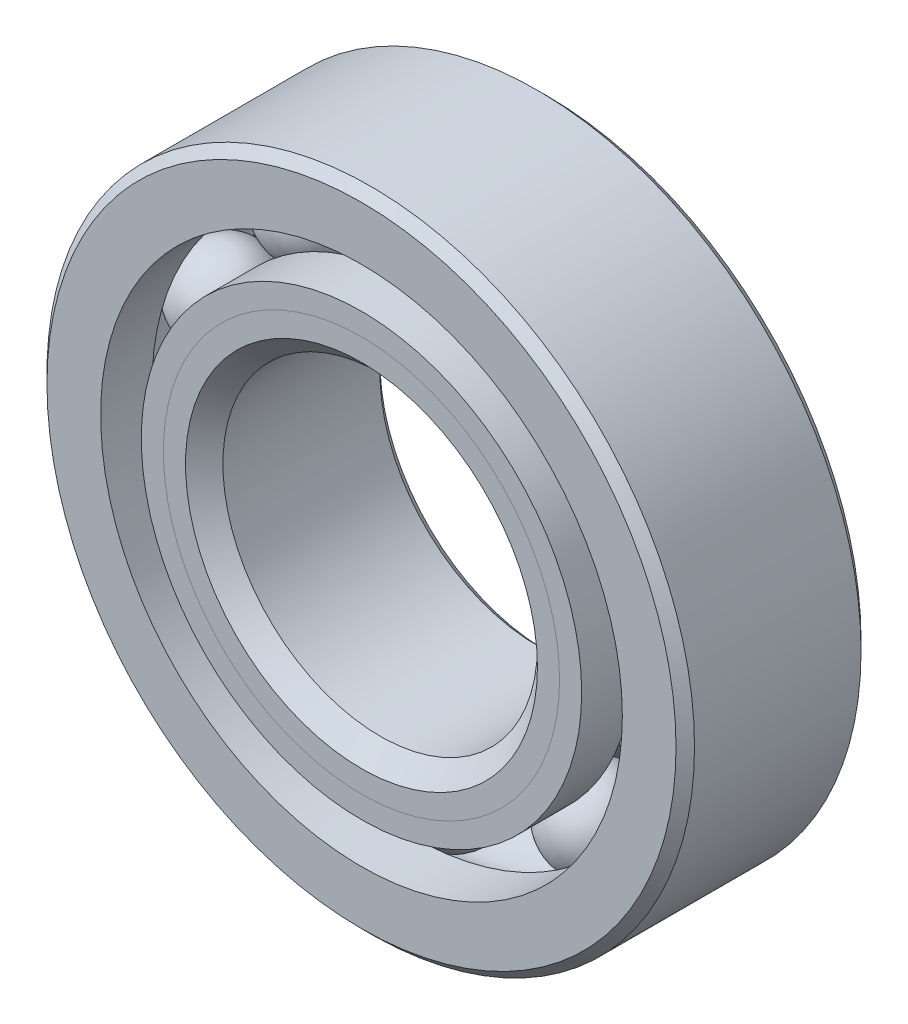
ISO-10303-21;
HEADER;
FILE_DESCRIPTION(('STEP AP214'),'2;1');
FILE_NAME('part.step','',(''),(''),'','','');
FILE_SCHEMA(('AUTOMOTIVE_DESIGN { 1 0 10303 214 1 1 1 1 }'));
ENDSEC;
DATA;
#1=APPLICATION_CONTEXT('core data for automotive mechanical design processes');
#2=APPLICATION_PROTOCOL_DEFINITION('international standard','automotive_design',2000,#1);
#3=PRODUCT_CONTEXT('',#1,'mechanical');
#4=PRODUCT('Part','Part','',(#3));
#5=PRODUCT_RELATED_PRODUCT_CATEGORY('part','',(#4));
#6=PRODUCT_DEFINITION_FORMATION('','',#4);
#7=PRODUCT_DEFINITION_CONTEXT('part definition',#1,'design');
#8=PRODUCT_DEFINITION('design','',#6,#7);
#9=PRODUCT_DEFINITION_SHAPE('','',#8);
#10=(LENGTH_UNIT() NAMED_UNIT(*) SI_UNIT(.MILLI.,.METRE.));
#11=(NAMED_UNIT(*) PLANE_ANGLE_UNIT() SI_UNIT($,.RADIAN.));
#12=(NAMED_UNIT(*) SI_UNIT($,.STERADIAN.) SOLID_ANGLE_UNIT());
#13=UNCERTAINTY_MEASURE_WITH_UNIT(LENGTH_MEASURE(1.E-05),#10,'distance_accuracy_value','');
#14=(GEOMETRIC_REPRESENTATION_CONTEXT(3) GLOBAL_UNCERTAINTY_ASSIGNED_CONTEXT((#13)) GLOBAL_UNIT_ASSIGNED_CONTEXT((#10,
#11,#12)) REPRESENTATION_CONTEXT('',''));
#15=CARTESIAN_POINT('',(0.,0.,0.));
#16=DIRECTION('',(0.,0.,1.));
#17=DIRECTION('',(1.,0.,0.));
#18=AXIS2_PLACEMENT_3D('',#15,#16,#17);
#19=CARTESIAN_POINT('',(-7.64120827980201,10.5172209268744,0.));
#20=DIRECTION('',(0.,0.,1.));
#21=DIRECTION('',(-0.587785252292462,0.809016994374955,0.));
#22=AXIS2_PLACEMENT_3D('',#19,#20,#21);
#23=SPHERICAL_SURFACE('',#22,2.47908354641475);
#24=CARTESIAN_POINT('',(-7.64120827980201,10.5172209268744,2.47908354641474));
#25=VERTEX_POINT('',#24);
#26=VERTEX_LOOP('',#25);
#27=FACE_BOUND('',#26,.T.);
#28=ADVANCED_FACE('F49',(#27),#23,.T.);
#29=CLOSED_SHELL('',(#28));
#30=MANIFOLD_SOLID_BREP('B2',#29);
#31=CARTESIAN_POINT('',(-12.363734711837,4.01722092687446,0.));
#32=DIRECTION('',(0.,0.,1.));
#33=DIRECTION('',(-0.95105651629515,0.309016994374958,0.));
#34=AXIS2_PLACEMENT_3D('',#31,#32,#33);
#35=SPHERICAL_SURFACE('',#34,2.47908354641475);
#36=CARTESIAN_POINT('',(-12.363734711837,4.01722092687446,2.47908354641474));
#37=VERTEX_POINT('',#36);
#38=VERTEX_LOOP('',#37);
#39=FACE_BOUND('',#38,.T.);
#40=ADVANCED_FACE('F88',(#39),#35,.T.);
#41=CLOSED_SHELL('',(#40));
#42=MANIFOLD_SOLID_BREP('B6',#41);
#43=CARTESIAN_POINT('',(-12.363734711837,-4.0172209268742,0.));
#44=DIRECTION('',(0.,0.,1.));
#45=DIRECTION('',(-0.951056516295157,-0.309016994374938,0.));
#46=AXIS2_PLACEMENT_3D('',#43,#44,#45);
#47=SPHERICAL_SURFACE('',#46,2.47908354641475);
#48=CARTESIAN_POINT('',(-12.363734711837,-4.0172209268742,2.47908354641474));
#49=VERTEX_POINT('',#48);
#50=VERTEX_LOOP('',#49);
#51=FACE_BOUND('',#50,.T.);
#52=ADVANCED_FACE('F127',(#51),#47,.T.);
#53=CLOSED_SHELL('',(#52));
#54=MANIFOLD_SOLID_BREP('B45',#53);
#55=CARTESIAN_POINT('',(-7.64120827980224,-10.5172209268743,0.));
#56=DIRECTION('',(0.,0.,1.));
#57=DIRECTION('',(-0.58778525229248,-0.809016994374942,0.));
#58=AXIS2_PLACEMENT_3D('',#55,#56,#57);
#59=SPHERICAL_SURFACE('',#58,2.47908354641475);
#60=CARTESIAN_POINT('',(-7.64120827980224,-10.5172209268743,2.47908354641474));
#61=VERTEX_POINT('',#60);
#62=VERTEX_LOOP('',#61);
#63=FACE_BOUND('',#62,.T.);
#64=ADVANCED_FACE('F166',(#63),#59,.T.);
#65=CLOSED_SHELL('',(#64));
#66=MANIFOLD_SOLID_BREP('B84',#65);
#67=CARTESIAN_POINT('',(0.,-13.,0.));
#68=DIRECTION('',(0.,0.,1.));
#69=DIRECTION('',(0.,-1.,0.));
#70=AXIS2_PLACEMENT_3D('',#67,#68,#69);
#71=SPHERICAL_SURFACE('',#70,2.47908354641475);
#72=CARTESIAN_POINT('',(0.,-13.,2.47908354641474));
#73=VERTEX_POINT('',#72);
#74=VERTEX_LOOP('',#73);
#75=FACE_BOUND('',#74,.T.);
#76=ADVANCED_FACE('F205',(#75),#71,.T.);
#77=CLOSED_SHELL('',(#76));
#78=MANIFOLD_SOLID_BREP('B123',#77);
#79=CARTESIAN_POINT('',(7.64120827980209,-10.5172209268744,0.));
#80=DIRECTION('',(0.,0.,1.));
#81=DIRECTION('',(0.587785252292469,-0.809016994374951,0.));
#82=AXIS2_PLACEMENT_3D('',#79,#80,#81);
#83=SPHERICAL_SURFACE('',#82,2.47908354641475);
#84=CARTESIAN_POINT('',(7.64120827980209,-10.5172209268744,2.47908354641474));
#85=VERTEX_POINT('',#84);
#86=VERTEX_LOOP('',#85);
#87=FACE_BOUND('',#86,.T.);
#88=ADVANCED_FACE('F244',(#87),#83,.T.);
#89=CLOSED_SHELL('',(#88));
#90=MANIFOLD_SOLID_BREP('B162',#89);
#91=CARTESIAN_POINT('',(12.363734711837,-4.01722092687437,0.));
#92=DIRECTION('',(0.,0.,1.));
#93=DIRECTION('',(0.951056516295152,-0.309016994374952,0.));
#94=AXIS2_PLACEMENT_3D('',#91,#92,#93);
#95=SPHERICAL_SURFACE('',#94,2.47908354641475);
#96=CARTESIAN_POINT('',(12.363734711837,-4.01722092687437,2.47908354641474));
#97=VERTEX_POINT('',#96);
#98=VERTEX_LOOP('',#97);
#99=FACE_BOUND('',#98,.T.);
#100=ADVANCED_FACE('F281',(#99),#95,.T.);
#101=CLOSED_SHELL('',(#100));
#102=MANIFOLD_SOLID_BREP('B201',#101);
#103=CARTESIAN_POINT('',(12.363734711837,4.01722092687428,0.));
#104=DIRECTION('',(0.,0.,1.));
#105=DIRECTION('',(0.951056516295155,0.309016994374945,0.));
#106=AXIS2_PLACEMENT_3D('',#103,#104,#105);
#107=SPHERICAL_SURFACE('',#106,2.47908354641475);
#108=CARTESIAN_POINT('',(12.363734711837,4.01722092687428,2.47908354641474));
#109=VERTEX_POINT('',#108);
#110=VERTEX_LOOP('',#109);
#111=FACE_BOUND('',#110,.T.);
#112=ADVANCED_FACE('F318',(#111),#107,.T.);
#113=CLOSED_SHELL('',(#112));
#114=MANIFOLD_SOLID_BREP('B240',#113);
#115=CARTESIAN_POINT('',(7.64120827980217,10.5172209268743,0.));
#116=DIRECTION('',(0.,0.,1.));
#117=DIRECTION('',(0.587785252292474,0.809016994374947,0.));
#118=AXIS2_PLACEMENT_3D('',#115,#116,#117);
#119=SPHERICAL_SURFACE('',#118,2.47908354641475);
#120=CARTESIAN_POINT('',(7.64120827980217,10.5172209268743,2.47908354641474));
#121=VERTEX_POINT('',#120);
#122=VERTEX_LOOP('',#121);
#123=FACE_BOUND('',#122,.T.);
#124=ADVANCED_FACE('F357',(#123),#119,.T.);
#125=CLOSED_SHELL('',(#124));
#126=MANIFOLD_SOLID_BREP('B277',#125);
#127=CARTESIAN_POINT('',(0.,13.,0.));
#128=DIRECTION('',(0.,0.,1.));
#129=DIRECTION('',(0.,1.,0.));
#130=AXIS2_PLACEMENT_3D('',#127,#128,#129);
#131=SPHERICAL_SURFACE('',#130,2.47908354641475);
#132=CARTESIAN_POINT('',(0.,13.,2.47908354641474));
#133=VERTEX_POINT('',#132);
#134=VERTEX_LOOP('',#133);
#135=FACE_BOUND('',#134,.T.);
#136=ADVANCED_FACE('F396',(#135),#131,.T.);
#137=CLOSED_SHELL('',(#136));
#138=MANIFOLD_SOLID_BREP('B314',#137);
#139=CARTESIAN_POINT('',(0.,10.7057785639458,5.));
#140=DIRECTION('',(0.,0.,-1.));
#141=DIRECTION('',(-1.,0.,0.));
#142=AXIS2_PLACEMENT_3D('',#139,#140,#141);
#143=PLANE('',#142);
#144=CARTESIAN_POINT('',(0.,0.,5.));
#145=DIRECTION('',(0.,0.,1.));
#146=DIRECTION('',(1.,0.,0.));
#147=AXIS2_PLACEMENT_3D('',#144,#145,#146);
#148=CIRCLE('',#147,9.51045822679263);
#149=CARTESIAN_POINT('',(9.51045822679263,0.,5.));
#150=VERTEX_POINT('',#149);
#151=EDGE_CURVE('E463',#150,#150,#148,.T.);
#152=ORIENTED_EDGE('',*,*,#151,.F.);
#153=EDGE_LOOP('',(#152));
#154=FACE_BOUND('',#153,.T.);
#155=CARTESIAN_POINT('',(0.,0.,5.));
#156=DIRECTION('',(0.,0.,1.));
#157=DIRECTION('',(1.,0.,0.));
#158=AXIS2_PLACEMENT_3D('',#155,#156,#157);
#159=CIRCLE('',#158,10.7057785639458);
#160=CARTESIAN_POINT('',(10.7057785639458,0.,5.));
#161=VERTEX_POINT('',#160);
#162=EDGE_CURVE('E395',#161,#161,#159,.T.);
#163=ORIENTED_EDGE('',*,*,#162,.T.);
#164=EDGE_LOOP('',(#163));
#165=FACE_BOUND('',#164,.T.);
#166=ADVANCED_FACE('F418',(#154,#165),#143,.F.);
#167=CARTESIAN_POINT('',(0.,0.,3.80467966284687));
#168=DIRECTION('',(0.,0.,1.));
#169=DIRECTION('',(1.,0.,0.));
#170=AXIS2_PLACEMENT_3D('',#167,#168,#169);
#171=CONICAL_SURFACE('',#170,9.51045822679263,0.78539816339745);
#172=ORIENTED_EDGE('',*,*,#162,.F.);
#173=EDGE_LOOP('',(#172));
#174=FACE_BOUND('',#173,.T.);
#175=CARTESIAN_POINT('',(0.,0.,3.80467966284687));
#176=DIRECTION('',(0.,0.,1.));
#177=DIRECTION('',(1.,0.,0.));
#178=AXIS2_PLACEMENT_3D('',#175,#176,#177);
#179=CIRCLE('',#178,9.51045822679263);
#180=CARTESIAN_POINT('',(9.51045822679263,0.,3.80467966284687));
#181=VERTEX_POINT('',#180);
#182=EDGE_CURVE('E425',#181,#181,#179,.T.);
#183=ORIENTED_EDGE('',*,*,#182,.T.);
#184=EDGE_LOOP('',(#183));
#185=FACE_BOUND('',#184,.T.);
#186=ADVANCED_FACE('F472',(#174,#185),#171,.T.);
#187=CARTESIAN_POINT('',(0.,0.,5.));
#188=DIRECTION('',(0.,0.,1.));
#189=DIRECTION('',(1.,0.,0.));
#190=AXIS2_PLACEMENT_3D('',#187,#188,#189);
#191=CYLINDRICAL_SURFACE('',#190,9.51045822679263);
#192=ORIENTED_EDGE('',*,*,#182,.F.);
#193=EDGE_LOOP('',(#192));
#194=FACE_BOUND('',#193,.T.);
#195=CARTESIAN_POINT('',(0.,0.,0.));
#196=DIRECTION('',(0.,0.,1.));
#197=DIRECTION('',(1.,0.,0.));
#198=AXIS2_PLACEMENT_3D('',#195,#196,#197);
#199=CIRCLE('',#198,9.51045822679263);
#200=CARTESIAN_POINT('',(9.51045822679263,0.,0.));
#201=VERTEX_POINT('',#200);
#202=EDGE_CURVE('E431',#201,#201,#199,.T.);
#203=ORIENTED_EDGE('',*,*,#202,.T.);
#204=EDGE_LOOP('',(#203));
#205=FACE_BOUND('',#204,.T.);
#206=ADVANCED_FACE('F476',(#194,#205),#191,.T.);
#207=CARTESIAN_POINT('',(0.,9.51045822679263,0.));
#208=DIRECTION('',(0.,0.,-1.));
#209=DIRECTION('',(-1.,0.,0.));
#210=AXIS2_PLACEMENT_3D('',#207,#208,#209);
#211=PLANE('',#210);
#212=ORIENTED_EDGE('',*,*,#202,.F.);
#213=EDGE_LOOP('',(#212));
#214=FACE_BOUND('',#213,.T.);
#215=CARTESIAN_POINT('',(0.,0.,0.));
#216=DIRECTION('',(0.,0.,1.));
#217=DIRECTION('',(1.,0.,0.));
#218=AXIS2_PLACEMENT_3D('',#215,#216,#217);
#219=CIRCLE('',#218,10.5209164535853);
#220=CARTESIAN_POINT('',(10.5209164535853,0.,0.));
#221=VERTEX_POINT('',#220);
#222=EDGE_CURVE('E437',#221,#221,#219,.T.);
#223=ORIENTED_EDGE('',*,*,#222,.T.);
#224=EDGE_LOOP('',(#223));
#225=FACE_BOUND('',#224,.T.);
#226=ADVANCED_FACE('F481',(#214,#225),#211,.F.);
#227=CARTESIAN_POINT('',(0.,0.,0.));
#228=DIRECTION('',(0.,0.,1.));
#229=DIRECTION('',(1.,0.,0.));
#230=AXIS2_PLACEMENT_3D('',#227,#228,#229);
#231=TOROIDAL_SURFACE('',#230,13.,2.47908354641474);
#232=ORIENTED_EDGE('',*,*,#222,.F.);
#233=EDGE_LOOP('',(#232));
#234=FACE_BOUND('',#233,.T.);
#235=CARTESIAN_POINT('',(0.,0.,-2.22222222222222));
#236=DIRECTION('',(0.,0.,1.));
#237=DIRECTION('',(1.,0.,0.));
#238=AXIS2_PLACEMENT_3D('',#235,#236,#237);
#239=CIRCLE('',#238,11.9010989010989);
#240=CARTESIAN_POINT('',(11.9010989010989,0.,-2.22222222222222));
#241=VERTEX_POINT('',#240);
#242=EDGE_CURVE('E443',#241,#241,#239,.T.);
#243=ORIENTED_EDGE('',*,*,#242,.T.);
#244=EDGE_LOOP('',(#243));
#245=FACE_BOUND('',#244,.T.);
#246=ADVANCED_FACE('F487',(#234,#245),#231,.F.);
#247=CARTESIAN_POINT('',(0.,0.,5.));
#248=DIRECTION('',(0.,0.,1.));
#249=DIRECTION('',(1.,0.,0.));
#250=AXIS2_PLACEMENT_3D('',#247,#248,#249);
#251=CYLINDRICAL_SURFACE('',#250,11.9010989010989);
#252=ORIENTED_EDGE('',*,*,#242,.F.);
#253=EDGE_LOOP('',(#252));
#254=FACE_BOUND('',#253,.T.);
#255=CARTESIAN_POINT('',(0.,0.,-5.));
#256=DIRECTION('',(0.,0.,1.));
#257=DIRECTION('',(1.,0.,0.));
#258=AXIS2_PLACEMENT_3D('',#255,#256,#257);
#259=CIRCLE('',#258,11.9010989010989);
#260=CARTESIAN_POINT('',(11.9010989010989,0.,-5.));
#261=VERTEX_POINT('',#260);
#262=EDGE_CURVE('E447',#261,#261,#259,.T.);
#263=ORIENTED_EDGE('',*,*,#262,.T.);
#264=EDGE_LOOP('',(#263));
#265=FACE_BOUND('',#264,.T.);
#266=ADVANCED_FACE('F491',(#254,#265),#251,.T.);
#267=CARTESIAN_POINT('',(0.,9.,-5.));
#268=DIRECTION('',(0.,0.,1.));
#269=DIRECTION('',(1.,0.,0.));
#270=AXIS2_PLACEMENT_3D('',#267,#268,#269);
#271=PLANE('',#270);
#272=ORIENTED_EDGE('',*,*,#262,.F.);
#273=EDGE_LOOP('',(#272));
#274=FACE_BOUND('',#273,.T.);
#275=CARTESIAN_POINT('',(0.,0.,-5.));
#276=DIRECTION('',(0.,0.,1.));
#277=DIRECTION('',(1.,0.,0.));
#278=AXIS2_PLACEMENT_3D('',#275,#276,#277);
#279=CIRCLE('',#278,9.);
#280=CARTESIAN_POINT('',(9.,0.,-5.));
#281=VERTEX_POINT('',#280);
#282=EDGE_CURVE('E451',#281,#281,#279,.T.);
#283=ORIENTED_EDGE('',*,*,#282,.T.);
#284=EDGE_LOOP('',(#283));
#285=FACE_BOUND('',#284,.T.);
#286=ADVANCED_FACE('F495',(#274,#285),#271,.F.);
#287=CARTESIAN_POINT('',(0.,0.,-4.5));
#288=DIRECTION('',(0.,0.,-1.));
#289=DIRECTION('',(-1.,0.,0.));
#290=AXIS2_PLACEMENT_3D('',#287,#288,#289);
#291=CONICAL_SURFACE('',#290,8.5,0.785398163397448);
#292=ORIENTED_EDGE('',*,*,#282,.F.);
#293=EDGE_LOOP('',(#292));
#294=FACE_BOUND('',#293,.T.);
#295=CARTESIAN_POINT('',(0.,0.,-4.5));
#296=DIRECTION('',(0.,0.,1.));
#297=DIRECTION('',(1.,0.,0.));
#298=AXIS2_PLACEMENT_3D('',#295,#296,#297);
#299=CIRCLE('',#298,8.5);
#300=CARTESIAN_POINT('',(8.5,0.,-4.5));
#301=VERTEX_POINT('',#300);
#302=EDGE_CURVE('E455',#301,#301,#299,.T.);
#303=ORIENTED_EDGE('',*,*,#302,.T.);
#304=EDGE_LOOP('',(#303));
#305=FACE_BOUND('',#304,.T.);
#306=ADVANCED_FACE('F499',(#294,#305),#291,.F.);
#307=CARTESIAN_POINT('',(0.,0.,5.));
#308=DIRECTION('',(0.,0.,1.));
#309=DIRECTION('',(1.,0.,0.));
#310=AXIS2_PLACEMENT_3D('',#307,#308,#309);
#311=CYLINDRICAL_SURFACE('',#310,8.5);
#312=ORIENTED_EDGE('',*,*,#302,.F.);
#313=EDGE_LOOP('',(#312));
#314=FACE_BOUND('',#313,.T.);
#315=CARTESIAN_POINT('',(0.,0.,3.98954177320738));
#316=DIRECTION('',(0.,0.,1.));
#317=DIRECTION('',(1.,0.,0.));
#318=AXIS2_PLACEMENT_3D('',#315,#316,#317);
#319=CIRCLE('',#318,8.5);
#320=CARTESIAN_POINT('',(8.5,0.,3.98954177320738));
#321=VERTEX_POINT('',#320);
#322=EDGE_CURVE('E459',#321,#321,#319,.T.);
#323=ORIENTED_EDGE('',*,*,#322,.T.);
#324=EDGE_LOOP('',(#323));
#325=FACE_BOUND('',#324,.T.);
#326=ADVANCED_FACE('F503',(#314,#325),#311,.F.);
#327=CARTESIAN_POINT('',(0.,0.,5.));
#328=DIRECTION('',(0.,0.,1.));
#329=DIRECTION('',(1.,0.,0.));
#330=AXIS2_PLACEMENT_3D('',#327,#328,#329);
#331=CONICAL_SURFACE('',#330,9.51045822679263,0.78539816339745);
#332=ORIENTED_EDGE('',*,*,#322,.F.);
#333=EDGE_LOOP('',(#332));
#334=FACE_BOUND('',#333,.T.);
#335=ORIENTED_EDGE('',*,*,#151,.T.);
#336=EDGE_LOOP('',(#335));
#337=FACE_BOUND('',#336,.T.);
#338=ADVANCED_FACE('F469',(#334,#337),#331,.F.);
#339=CLOSED_SHELL('',(#166,#186,#206,#226,#246,#266,#286,#306,#326,#338));
#340=MANIFOLD_SOLID_BREP('B353',#339);
#341=CARTESIAN_POINT('',(0.,11.9010989010989,5.));
#342=DIRECTION('',(0.,0.,-1.));
#343=DIRECTION('',(-1.,0.,0.));
#344=AXIS2_PLACEMENT_3D('',#341,#342,#343);
#345=PLANE('',#344);
#346=CARTESIAN_POINT('',(0.,0.,5.));
#347=DIRECTION('',(0.,0.,1.));
#348=DIRECTION('',(1.,0.,0.));
#349=AXIS2_PLACEMENT_3D('',#346,#347,#348);
#350=CIRCLE('',#349,10.7057785639458);
#351=CARTESIAN_POINT('',(10.7057785639458,0.,5.));
#352=VERTEX_POINT('',#351);
#353=EDGE_CURVE('E417',#352,#352,#350,.T.);
#354=ORIENTED_EDGE('',*,*,#353,.F.);
#355=EDGE_LOOP('',(#354));
#356=FACE_BOUND('',#355,.T.);
#357=CARTESIAN_POINT('',(0.,0.,5.));
#358=DIRECTION('',(0.,0.,1.));
#359=DIRECTION('',(1.,0.,0.));
#360=AXIS2_PLACEMENT_3D('',#357,#358,#359);
#361=CIRCLE('',#360,11.9010989010989);
#362=CARTESIAN_POINT('',(11.9010989010989,0.,5.));
#363=VERTEX_POINT('',#362);
#364=EDGE_CURVE('E645',#363,#363,#361,.T.);
#365=ORIENTED_EDGE('',*,*,#364,.T.);
#366=EDGE_LOOP('',(#365));
#367=FACE_BOUND('',#366,.T.);
#368=ADVANCED_FACE('F616',(#356,#367),#345,.F.);
#369=CARTESIAN_POINT('',(0.,0.,5.));
#370=DIRECTION('',(0.,0.,1.));
#371=DIRECTION('',(1.,0.,0.));
#372=AXIS2_PLACEMENT_3D('',#369,#370,#371);
#373=CONICAL_SURFACE('',#372,10.7057785639458,0.78539816339745);
#374=CARTESIAN_POINT('',(0.,0.,3.80467966284687));
#375=DIRECTION('',(0.,0.,1.));
#376=DIRECTION('',(1.,0.,0.));
#377=AXIS2_PLACEMENT_3D('',#374,#375,#376);
#378=CIRCLE('',#377,9.51045822679263);
#379=CARTESIAN_POINT('',(9.51045822679263,0.,3.80467966284687));
#380=VERTEX_POINT('',#379);
#381=EDGE_CURVE('E623',#380,#380,#378,.T.);
#382=ORIENTED_EDGE('',*,*,#381,.F.);
#383=EDGE_LOOP('',(#382));
#384=FACE_BOUND('',#383,.T.);
#385=ORIENTED_EDGE('',*,*,#353,.T.);
#386=EDGE_LOOP('',(#385));
#387=FACE_BOUND('',#386,.T.);
#388=ADVANCED_FACE('F672',(#384,#387),#373,.F.);
#389=CARTESIAN_POINT('',(0.,0.,5.));
#390=DIRECTION('',(0.,0.,1.));
#391=DIRECTION('',(1.,0.,0.));
#392=AXIS2_PLACEMENT_3D('',#389,#390,#391);
#393=CYLINDRICAL_SURFACE('',#392,9.51045822679263);
#394=CARTESIAN_POINT('',(0.,0.,0.));
#395=DIRECTION('',(0.,0.,1.));
#396=DIRECTION('',(1.,0.,0.));
#397=AXIS2_PLACEMENT_3D('',#394,#395,#396);
#398=CIRCLE('',#397,9.51045822679263);
#399=CARTESIAN_POINT('',(9.51045822679263,0.,0.));
#400=VERTEX_POINT('',#399);
#401=EDGE_CURVE('E629',#400,#400,#398,.T.);
#402=ORIENTED_EDGE('',*,*,#401,.F.);
#403=EDGE_LOOP('',(#402));
#404=FACE_BOUND('',#403,.T.);
#405=ORIENTED_EDGE('',*,*,#381,.T.);
#406=EDGE_LOOP('',(#405));
#407=FACE_BOUND('',#406,.T.);
#408=ADVANCED_FACE('F667',(#404,#407),#393,.F.);
#409=CARTESIAN_POINT('',(0.,9.51045822679263,0.));
#410=DIRECTION('',(0.,0.,1.));
#411=DIRECTION('',(1.,0.,0.));
#412=AXIS2_PLACEMENT_3D('',#409,#410,#411);
#413=PLANE('',#412);
#414=CARTESIAN_POINT('',(0.,0.,0.));
#415=DIRECTION('',(0.,0.,1.));
#416=DIRECTION('',(1.,0.,0.));
#417=AXIS2_PLACEMENT_3D('',#414,#415,#416);
#418=CIRCLE('',#417,10.5209164535853);
#419=CARTESIAN_POINT('',(10.5209164535853,0.,0.));
#420=VERTEX_POINT('',#419);
#421=EDGE_CURVE('E635',#420,#420,#418,.T.);
#422=ORIENTED_EDGE('',*,*,#421,.F.);
#423=EDGE_LOOP('',(#422));
#424=FACE_BOUND('',#423,.T.);
#425=ORIENTED_EDGE('',*,*,#401,.T.);
#426=EDGE_LOOP('',(#425));
#427=FACE_BOUND('',#426,.T.);
#428=ADVANCED_FACE('F661',(#424,#427),#413,.F.);
#429=CARTESIAN_POINT('',(0.,0.,0.));
#430=DIRECTION('',(0.,0.,1.));
#431=DIRECTION('',(1.,0.,0.));
#432=AXIS2_PLACEMENT_3D('',#429,#430,#431);
#433=TOROIDAL_SURFACE('',#432,13.,2.47908354641475);
#434=CARTESIAN_POINT('',(0.,0.,2.22222222222222));
#435=DIRECTION('',(0.,0.,1.));
#436=DIRECTION('',(1.,0.,0.));
#437=AXIS2_PLACEMENT_3D('',#434,#435,#436);
#438=CIRCLE('',#437,11.9010989010989);
#439=CARTESIAN_POINT('',(11.9010989010989,0.,2.22222222222222));
#440=VERTEX_POINT('',#439);
#441=EDGE_CURVE('E641',#440,#440,#438,.T.);
#442=ORIENTED_EDGE('',*,*,#441,.F.);
#443=EDGE_LOOP('',(#442));
#444=FACE_BOUND('',#443,.T.);
#445=ORIENTED_EDGE('',*,*,#421,.T.);
#446=EDGE_LOOP('',(#445));
#447=FACE_BOUND('',#446,.T.);
#448=ADVANCED_FACE('F655',(#444,#447),#433,.F.);
#449=CARTESIAN_POINT('',(0.,0.,5.));
#450=DIRECTION('',(0.,0.,1.));
#451=DIRECTION('',(1.,0.,0.));
#452=AXIS2_PLACEMENT_3D('',#449,#450,#451);
#453=CYLINDRICAL_SURFACE('',#452,11.9010989010989);
#454=ORIENTED_EDGE('',*,*,#364,.F.);
#455=EDGE_LOOP('',(#454));
#456=FACE_BOUND('',#455,.T.);
#457=ORIENTED_EDGE('',*,*,#441,.T.);
#458=EDGE_LOOP('',(#457));
#459=FACE_BOUND('',#458,.T.);
#460=ADVANCED_FACE('F652',(#456,#459),#453,.T.);
#461=CLOSED_SHELL('',(#368,#388,#408,#428,#448,#460));
#462=MANIFOLD_SOLID_BREP('B390',#461);
#463=CARTESIAN_POINT('',(0.,0.,4.5));
#464=DIRECTION('',(0.,0.,-1.));
#465=DIRECTION('',(-1.,0.,0.));
#466=AXIS2_PLACEMENT_3D('',#463,#464,#465);
#467=CONICAL_SURFACE('',#466,17.5,0.785398163397447);
#468=CARTESIAN_POINT('',(0.,0.,5.));
#469=DIRECTION('',(0.,0.,1.));
#470=DIRECTION('',(1.,0.,0.));
#471=AXIS2_PLACEMENT_3D('',#468,#469,#470);
#472=CIRCLE('',#471,17.);
#473=CARTESIAN_POINT('',(17.,0.,5.));
#474=VERTEX_POINT('',#473);
#475=EDGE_CURVE('E768',#474,#474,#472,.T.);
#476=ORIENTED_EDGE('',*,*,#475,.F.);
#477=EDGE_LOOP('',(#476));
#478=FACE_BOUND('',#477,.T.);
#479=CARTESIAN_POINT('',(0.,0.,4.5));
#480=DIRECTION('',(0.,0.,1.));
#481=DIRECTION('',(1.,0.,0.));
#482=AXIS2_PLACEMENT_3D('',#479,#480,#481);
#483=CIRCLE('',#482,17.5);
#484=CARTESIAN_POINT('',(17.5,0.,4.5));
#485=VERTEX_POINT('',#484);
#486=EDGE_CURVE('E615',#485,#485,#483,.T.);
#487=ORIENTED_EDGE('',*,*,#486,.T.);
#488=EDGE_LOOP('',(#487));
#489=FACE_BOUND('',#488,.T.);
#490=ADVANCED_FACE('F731',(#478,#489),#467,.T.);
#491=CARTESIAN_POINT('',(0.,0.,5.));
#492=DIRECTION('',(0.,0.,1.));
#493=DIRECTION('',(1.,0.,0.));
#494=AXIS2_PLACEMENT_3D('',#491,#492,#493);
#495=CYLINDRICAL_SURFACE('',#494,17.5);
#496=ORIENTED_EDGE('',*,*,#486,.F.);
#497=EDGE_LOOP('',(#496));
#498=FACE_BOUND('',#497,.T.);
#499=CARTESIAN_POINT('',(0.,0.,-4.5));
#500=DIRECTION('',(0.,0.,1.));
#501=DIRECTION('',(1.,0.,0.));
#502=AXIS2_PLACEMENT_3D('',#499,#500,#501);
#503=CIRCLE('',#502,17.5);
#504=CARTESIAN_POINT('',(17.5,0.,-4.5));
#505=VERTEX_POINT('',#504);
#506=EDGE_CURVE('E738',#505,#505,#503,.T.);
#507=ORIENTED_EDGE('',*,*,#506,.T.);
#508=EDGE_LOOP('',(#507));
#509=FACE_BOUND('',#508,.T.);
#510=ADVANCED_FACE('F777',(#498,#509),#495,.T.);
#511=CARTESIAN_POINT('',(0.,0.,-5.));
#512=DIRECTION('',(0.,0.,1.));
#513=DIRECTION('',(1.,0.,0.));
#514=AXIS2_PLACEMENT_3D('',#511,#512,#513);
#515=CONICAL_SURFACE('',#514,17.,0.785398163397448);
#516=ORIENTED_EDGE('',*,*,#506,.F.);
#517=EDGE_LOOP('',(#516));
#518=FACE_BOUND('',#517,.T.);
#519=CARTESIAN_POINT('',(0.,0.,-5.));
#520=DIRECTION('',(0.,0.,1.));
#521=DIRECTION('',(1.,0.,0.));
#522=AXIS2_PLACEMENT_3D('',#519,#520,#521);
#523=CIRCLE('',#522,17.);
#524=CARTESIAN_POINT('',(17.,0.,-5.));
#525=VERTEX_POINT('',#524);
#526=EDGE_CURVE('E744',#525,#525,#523,.T.);
#527=ORIENTED_EDGE('',*,*,#526,.T.);
#528=EDGE_LOOP('',(#527));
#529=FACE_BOUND('',#528,.T.);
#530=ADVANCED_FACE('F781',(#518,#529),#515,.T.);
#531=CARTESIAN_POINT('',(0.,17.,-5.));
#532=DIRECTION('',(0.,0.,1.));
#533=DIRECTION('',(1.,0.,0.));
#534=AXIS2_PLACEMENT_3D('',#531,#532,#533);
#535=PLANE('',#534);
#536=ORIENTED_EDGE('',*,*,#526,.F.);
#537=EDGE_LOOP('',(#536));
#538=FACE_BOUND('',#537,.T.);
#539=CARTESIAN_POINT('',(0.,0.,-5.));
#540=DIRECTION('',(0.,0.,1.));
#541=DIRECTION('',(1.,0.,0.));
#542=AXIS2_PLACEMENT_3D('',#539,#540,#541);
#543=CIRCLE('',#542,14.0989010989011);
#544=CARTESIAN_POINT('',(14.0989010989011,0.,-5.));
#545=VERTEX_POINT('',#544);
#546=EDGE_CURVE('E750',#545,#545,#543,.T.);
#547=ORIENTED_EDGE('',*,*,#546,.T.);
#548=EDGE_LOOP('',(#547));
#549=FACE_BOUND('',#548,.T.);
#550=ADVANCED_FACE('F786',(#538,#549),#535,.F.);
#551=CARTESIAN_POINT('',(0.,0.,5.));
#552=DIRECTION('',(0.,0.,1.));
#553=DIRECTION('',(1.,0.,0.));
#554=AXIS2_PLACEMENT_3D('',#551,#552,#553);
#555=CYLINDRICAL_SURFACE('',#554,14.0989010989011);
#556=ORIENTED_EDGE('',*,*,#546,.F.);
#557=EDGE_LOOP('',(#556));
#558=FACE_BOUND('',#557,.T.);
#559=CARTESIAN_POINT('',(0.,0.,-2.22222222222222));
#560=DIRECTION('',(0.,0.,1.));
#561=DIRECTION('',(1.,0.,0.));
#562=AXIS2_PLACEMENT_3D('',#559,#560,#561);
#563=CIRCLE('',#562,14.0989010989011);
#564=CARTESIAN_POINT('',(14.0989010989011,0.,-2.22222222222222));
#565=VERTEX_POINT('',#564);
#566=EDGE_CURVE('E756',#565,#565,#563,.T.);
#567=ORIENTED_EDGE('',*,*,#566,.T.);
#568=EDGE_LOOP('',(#567));
#569=FACE_BOUND('',#568,.T.);
#570=ADVANCED_FACE('F792',(#558,#569),#555,.F.);
#571=CARTESIAN_POINT('',(0.,0.,0.));
#572=DIRECTION('',(0.,0.,1.));
#573=DIRECTION('',(1.,0.,0.));
#574=AXIS2_PLACEMENT_3D('',#571,#572,#573);
#575=TOROIDAL_SURFACE('',#574,13.,2.47908354641475);
#576=ORIENTED_EDGE('',*,*,#566,.F.);
#577=EDGE_LOOP('',(#576));
#578=FACE_BOUND('',#577,.T.);
#579=CARTESIAN_POINT('',(0.,0.,2.22222222222222));
#580=DIRECTION('',(0.,0.,1.));
#581=DIRECTION('',(1.,0.,0.));
#582=AXIS2_PLACEMENT_3D('',#579,#580,#581);
#583=CIRCLE('',#582,14.0989010989011);
#584=CARTESIAN_POINT('',(14.0989010989011,0.,2.22222222222222));
#585=VERTEX_POINT('',#584);
#586=EDGE_CURVE('E760',#585,#585,#583,.T.);
#587=ORIENTED_EDGE('',*,*,#586,.T.);
#588=EDGE_LOOP('',(#587));
#589=FACE_BOUND('',#588,.T.);
#590=ADVANCED_FACE('F796',(#578,#589),#575,.F.);
#591=CARTESIAN_POINT('',(0.,0.,5.));
#592=DIRECTION('',(0.,0.,1.));
#593=DIRECTION('',(1.,0.,0.));
#594=AXIS2_PLACEMENT_3D('',#591,#592,#593);
#595=CYLINDRICAL_SURFACE('',#594,14.0989010989011);
#596=ORIENTED_EDGE('',*,*,#586,.F.);
#597=EDGE_LOOP('',(#596));
#598=FACE_BOUND('',#597,.T.);
#599=CARTESIAN_POINT('',(0.,0.,5.));
#600=DIRECTION('',(0.,0.,1.));
#601=DIRECTION('',(1.,0.,0.));
#602=AXIS2_PLACEMENT_3D('',#599,#600,#601);
#603=CIRCLE('',#602,14.0989010989011);
#604=CARTESIAN_POINT('',(14.0989010989011,0.,5.));
#605=VERTEX_POINT('',#604);
#606=EDGE_CURVE('E764',#605,#605,#603,.T.);
#607=ORIENTED_EDGE('',*,*,#606,.T.);
#608=EDGE_LOOP('',(#607));
#609=FACE_BOUND('',#608,.T.);
#610=ADVANCED_FACE('F800',(#598,#609),#595,.F.);
#611=CARTESIAN_POINT('',(0.,17.,5.));
#612=DIRECTION('',(0.,0.,-1.));
#613=DIRECTION('',(-1.,0.,0.));
#614=AXIS2_PLACEMENT_3D('',#611,#612,#613);
#615=PLANE('',#614);
#616=ORIENTED_EDGE('',*,*,#606,.F.);
#617=EDGE_LOOP('',(#616));
#618=FACE_BOUND('',#617,.T.);
#619=ORIENTED_EDGE('',*,*,#475,.T.);
#620=EDGE_LOOP('',(#619));
#621=FACE_BOUND('',#620,.T.);
#622=ADVANCED_FACE('F774',(#618,#621),#615,.F.);
#623=CLOSED_SHELL('',(#490,#510,#530,#550,#570,#590,#610,#622));
#624=MANIFOLD_SOLID_BREP('B412',#623);
#625=ADVANCED_BREP_SHAPE_REPRESENTATION('',(#18,#30,#42,#54,#66,#78,#90,#102,#114,#126,#138,
#340,#462,#624),#14);
#626=SHAPE_DEFINITION_REPRESENTATION(#9,#625);
ENDSEC;
END-ISO-10303-21;
